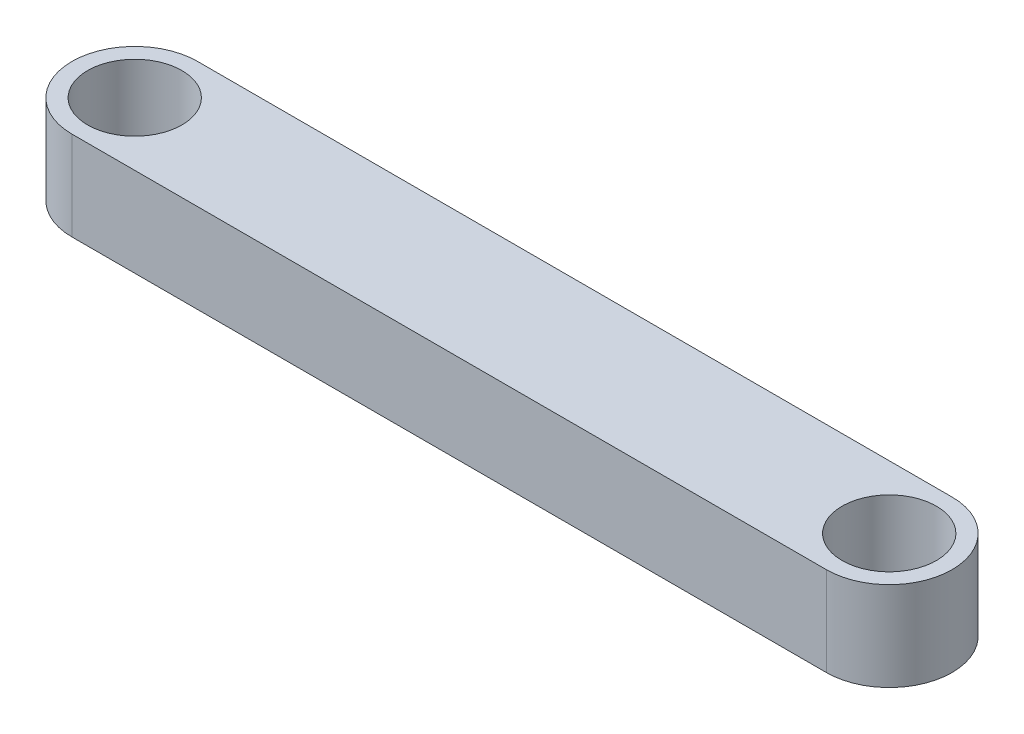
ISO-10303-21;
HEADER;
FILE_DESCRIPTION(('STEP AP214'),'2;1');
FILE_NAME('part.step','',(''),(''),'','','');
FILE_SCHEMA(('AUTOMOTIVE_DESIGN { 1 0 10303 214 1 1 1 1 }'));
ENDSEC;
DATA;
#1=APPLICATION_CONTEXT('core data for automotive mechanical design processes');
#2=APPLICATION_PROTOCOL_DEFINITION('international standard','automotive_design',2000,#1);
#3=PRODUCT_CONTEXT('',#1,'mechanical');
#4=PRODUCT('Part','Part','',(#3));
#5=PRODUCT_RELATED_PRODUCT_CATEGORY('part','',(#4));
#6=PRODUCT_DEFINITION_FORMATION('','',#4);
#7=PRODUCT_DEFINITION_CONTEXT('part definition',#1,'design');
#8=PRODUCT_DEFINITION('design','',#6,#7);
#9=PRODUCT_DEFINITION_SHAPE('','',#8);
#10=(LENGTH_UNIT() NAMED_UNIT(*) SI_UNIT(.MILLI.,.METRE.));
#11=(NAMED_UNIT(*) PLANE_ANGLE_UNIT() SI_UNIT($,.RADIAN.));
#12=(NAMED_UNIT(*) SI_UNIT($,.STERADIAN.) SOLID_ANGLE_UNIT());
#13=UNCERTAINTY_MEASURE_WITH_UNIT(LENGTH_MEASURE(1.E-05),#10,'distance_accuracy_value','');
#14=(GEOMETRIC_REPRESENTATION_CONTEXT(3) GLOBAL_UNCERTAINTY_ASSIGNED_CONTEXT((#13)) GLOBAL_UNIT_ASSIGNED_CONTEXT((#10,
#11,#12)) REPRESENTATION_CONTEXT('',''));
#15=CARTESIAN_POINT('',(0.,0.,0.));
#16=DIRECTION('',(0.,0.,1.));
#17=DIRECTION('',(1.,0.,0.));
#18=AXIS2_PLACEMENT_3D('',#15,#16,#17);
#19=CARTESIAN_POINT('',(158.75,37.5,0.));
#20=DIRECTION('',(0.,-1.,0.));
#21=DIRECTION('',(0.,0.,-1.));
#22=AXIS2_PLACEMENT_3D('',#19,#20,#21);
#23=PLANE('',#22);
#24=CARTESIAN_POINT('',(158.75,37.5,0.));
#25=DIRECTION('',(0.,1.,0.));
#26=DIRECTION('',(0.,0.,-1.));
#27=AXIS2_PLACEMENT_3D('',#24,#25,#26);
#28=CIRCLE('',#27,26.4583333333333);
#29=CARTESIAN_POINT('',(158.75,37.5,26.4583333333333));
#30=VERTEX_POINT('',#29);
#31=CARTESIAN_POINT('',(158.75,37.5,-26.4583333333333));
#32=VERTEX_POINT('',#31);
#33=EDGE_CURVE('E92',#30,#32,#28,.T.);
#34=ORIENTED_EDGE('',*,*,#33,.T.);
#35=DIRECTION('',(-1.,0.,0.));
#36=VECTOR('',#35,1.);
#37=CARTESIAN_POINT('',(-158.75,37.5,-26.4583333333333));
#38=LINE('',#37,#36);
#39=CARTESIAN_POINT('',(-158.75,37.5,-26.4583333333333));
#40=VERTEX_POINT('',#39);
#41=EDGE_CURVE('E87',#32,#40,#38,.T.);
#42=ORIENTED_EDGE('',*,*,#41,.T.);
#43=CARTESIAN_POINT('',(-158.75,37.5,0.));
#44=DIRECTION('',(0.,1.,0.));
#45=DIRECTION('',(0.,0.,1.));
#46=AXIS2_PLACEMENT_3D('',#43,#44,#45);
#47=CIRCLE('',#46,26.4583333333333);
#48=CARTESIAN_POINT('',(-158.75,37.5,26.4583333333333));
#49=VERTEX_POINT('',#48);
#50=EDGE_CURVE('E90',#40,#49,#47,.T.);
#51=ORIENTED_EDGE('',*,*,#50,.T.);
#52=DIRECTION('',(1.,0.,0.));
#53=VECTOR('',#52,1.);
#54=CARTESIAN_POINT('',(-158.75,37.5,26.4583333333333));
#55=LINE('',#54,#53);
#56=EDGE_CURVE('E57',#49,#30,#55,.T.);
#57=ORIENTED_EDGE('',*,*,#56,.T.);
#58=EDGE_LOOP('',(#34,#42,#51,#57));
#59=FACE_BOUND('',#58,.T.);
#60=CARTESIAN_POINT('',(-158.75,37.5,0.));
#61=DIRECTION('',(0.,1.,0.));
#62=DIRECTION('',(0.,0.,1.));
#63=AXIS2_PLACEMENT_3D('',#60,#61,#62);
#64=CIRCLE('',#63,19.84375);
#65=CARTESIAN_POINT('',(-158.75,37.5,19.84375));
#66=VERTEX_POINT('',#65);
#67=EDGE_CURVE('E112',#66,#66,#64,.T.);
#68=ORIENTED_EDGE('',*,*,#67,.F.);
#69=EDGE_LOOP('',(#68));
#70=FACE_BOUND('',#69,.T.);
#71=CARTESIAN_POINT('',(158.75,37.5,0.));
#72=DIRECTION('',(0.,1.,0.));
#73=DIRECTION('',(0.,0.,1.));
#74=AXIS2_PLACEMENT_3D('',#71,#72,#73);
#75=CIRCLE('',#74,19.84375);
#76=CARTESIAN_POINT('',(158.75,37.5,19.84375));
#77=VERTEX_POINT('',#76);
#78=EDGE_CURVE('E134',#77,#77,#75,.T.);
#79=ORIENTED_EDGE('',*,*,#78,.F.);
#80=EDGE_LOOP('',(#79));
#81=FACE_BOUND('',#80,.T.);
#82=ADVANCED_FACE('F39',(#59,#70,#81),#23,.F.);
#83=CARTESIAN_POINT('',(158.75,0.,0.));
#84=DIRECTION('',(0.,-1.,0.));
#85=DIRECTION('',(0.,0.,-1.));
#86=AXIS2_PLACEMENT_3D('',#83,#84,#85);
#87=PLANE('',#86);
#88=CARTESIAN_POINT('',(-158.75,0.,0.));
#89=DIRECTION('',(0.,1.,0.));
#90=DIRECTION('',(0.,0.,1.));
#91=AXIS2_PLACEMENT_3D('',#88,#89,#90);
#92=CIRCLE('',#91,19.84375);
#93=CARTESIAN_POINT('',(-158.75,0.,19.84375));
#94=VERTEX_POINT('',#93);
#95=EDGE_CURVE('E130',#94,#94,#92,.T.);
#96=ORIENTED_EDGE('',*,*,#95,.T.);
#97=EDGE_LOOP('',(#96));
#98=FACE_BOUND('',#97,.T.);
#99=CARTESIAN_POINT('',(158.75,0.,0.));
#100=DIRECTION('',(0.,1.,0.));
#101=DIRECTION('',(0.,0.,-1.));
#102=AXIS2_PLACEMENT_3D('',#99,#100,#101);
#103=CIRCLE('',#102,26.4583333333333);
#104=CARTESIAN_POINT('',(158.75,0.,26.4583333333333));
#105=VERTEX_POINT('',#104);
#106=CARTESIAN_POINT('',(158.75,0.,-26.4583333333333));
#107=VERTEX_POINT('',#106);
#108=EDGE_CURVE('E108',#105,#107,#103,.T.);
#109=ORIENTED_EDGE('',*,*,#108,.F.);
#110=DIRECTION('',(1.,0.,0.));
#111=VECTOR('',#110,1.);
#112=CARTESIAN_POINT('',(-158.75,0.,26.4583333333333));
#113=LINE('',#112,#111);
#114=CARTESIAN_POINT('',(-158.75,0.,26.4583333333333));
#115=VERTEX_POINT('',#114);
#116=EDGE_CURVE('E80',#115,#105,#113,.T.);
#117=ORIENTED_EDGE('',*,*,#116,.F.);
#118=CARTESIAN_POINT('',(-158.75,0.,0.));
#119=DIRECTION('',(0.,1.,0.));
#120=DIRECTION('',(0.,0.,1.));
#121=AXIS2_PLACEMENT_3D('',#118,#119,#120);
#122=CIRCLE('',#121,26.4583333333333);
#123=CARTESIAN_POINT('',(-158.75,0.,-26.4583333333333));
#124=VERTEX_POINT('',#123);
#125=EDGE_CURVE('E74',#124,#115,#122,.T.);
#126=ORIENTED_EDGE('',*,*,#125,.F.);
#127=DIRECTION('',(-1.,0.,0.));
#128=VECTOR('',#127,1.);
#129=CARTESIAN_POINT('',(-158.75,0.,-26.4583333333333));
#130=LINE('',#129,#128);
#131=EDGE_CURVE('E97',#107,#124,#130,.T.);
#132=ORIENTED_EDGE('',*,*,#131,.F.);
#133=EDGE_LOOP('',(#109,#117,#126,#132));
#134=FACE_BOUND('',#133,.T.);
#135=CARTESIAN_POINT('',(158.75,0.,0.));
#136=DIRECTION('',(0.,1.,0.));
#137=DIRECTION('',(0.,0.,1.));
#138=AXIS2_PLACEMENT_3D('',#135,#136,#137);
#139=CIRCLE('',#138,19.84375);
#140=CARTESIAN_POINT('',(158.75,0.,19.84375));
#141=VERTEX_POINT('',#140);
#142=EDGE_CURVE('E138',#141,#141,#139,.T.);
#143=ORIENTED_EDGE('',*,*,#142,.T.);
#144=EDGE_LOOP('',(#143));
#145=FACE_BOUND('',#144,.T.);
#146=ADVANCED_FACE('F125',(#98,#134,#145),#87,.T.);
#147=CARTESIAN_POINT('',(158.75,37.5,0.));
#148=DIRECTION('',(0.,-1.,0.));
#149=DIRECTION('',(0.,0.,-1.));
#150=AXIS2_PLACEMENT_3D('',#147,#148,#149);
#151=CYLINDRICAL_SURFACE('',#150,26.4583333333333);
#152=ORIENTED_EDGE('',*,*,#108,.T.);
#153=DIRECTION('',(0.,-1.,0.));
#154=VECTOR('',#153,1.);
#155=CARTESIAN_POINT('',(158.75,37.5,-26.4583333333333));
#156=LINE('',#155,#154);
#157=EDGE_CURVE('E11',#32,#107,#156,.T.);
#158=ORIENTED_EDGE('',*,*,#157,.F.);
#159=ORIENTED_EDGE('',*,*,#33,.F.);
#160=DIRECTION('',(0.,-1.,0.));
#161=VECTOR('',#160,1.);
#162=CARTESIAN_POINT('',(158.75,37.5,26.4583333333333));
#163=LINE('',#162,#161);
#164=EDGE_CURVE('E104',#30,#105,#163,.T.);
#165=ORIENTED_EDGE('',*,*,#164,.T.);
#166=EDGE_LOOP('',(#152,#158,#159,#165));
#167=FACE_BOUND('',#166,.T.);
#168=ADVANCED_FACE('F41',(#167),#151,.T.);
#169=CARTESIAN_POINT('',(-158.75,37.5,-26.4583333333333));
#170=DIRECTION('',(0.,0.,1.));
#171=DIRECTION('',(1.,0.,0.));
#172=AXIS2_PLACEMENT_3D('',#169,#170,#171);
#173=PLANE('',#172);
#174=ORIENTED_EDGE('',*,*,#131,.T.);
#175=DIRECTION('',(0.,-1.,0.));
#176=VECTOR('',#175,1.);
#177=CARTESIAN_POINT('',(-158.75,37.5,-26.4583333333333));
#178=LINE('',#177,#176);
#179=EDGE_CURVE('E49',#40,#124,#178,.T.);
#180=ORIENTED_EDGE('',*,*,#179,.F.);
#181=ORIENTED_EDGE('',*,*,#41,.F.);
#182=ORIENTED_EDGE('',*,*,#157,.T.);
#183=EDGE_LOOP('',(#174,#180,#181,#182));
#184=FACE_BOUND('',#183,.T.);
#185=ADVANCED_FACE('F96',(#184),#173,.F.);
#186=CARTESIAN_POINT('',(-158.75,37.5,0.));
#187=DIRECTION('',(0.,-1.,0.));
#188=DIRECTION('',(0.,0.,-1.));
#189=AXIS2_PLACEMENT_3D('',#186,#187,#188);
#190=CYLINDRICAL_SURFACE('',#189,26.4583333333333);
#191=ORIENTED_EDGE('',*,*,#125,.T.);
#192=DIRECTION('',(0.,-1.,0.));
#193=VECTOR('',#192,1.);
#194=CARTESIAN_POINT('',(-158.75,37.5,26.4583333333333));
#195=LINE('',#194,#193);
#196=EDGE_CURVE('E99',#49,#115,#195,.T.);
#197=ORIENTED_EDGE('',*,*,#196,.F.);
#198=ORIENTED_EDGE('',*,*,#50,.F.);
#199=ORIENTED_EDGE('',*,*,#179,.T.);
#200=EDGE_LOOP('',(#191,#197,#198,#199));
#201=FACE_BOUND('',#200,.T.);
#202=ADVANCED_FACE('F100',(#201),#190,.T.);
#203=CARTESIAN_POINT('',(-158.75,37.5,26.4583333333333));
#204=DIRECTION('',(0.,0.,-1.));
#205=DIRECTION('',(-1.,0.,0.));
#206=AXIS2_PLACEMENT_3D('',#203,#204,#205);
#207=PLANE('',#206);
#208=ORIENTED_EDGE('',*,*,#116,.T.);
#209=ORIENTED_EDGE('',*,*,#164,.F.);
#210=ORIENTED_EDGE('',*,*,#56,.F.);
#211=ORIENTED_EDGE('',*,*,#196,.T.);
#212=EDGE_LOOP('',(#208,#209,#210,#211));
#213=FACE_BOUND('',#212,.T.);
#214=ADVANCED_FACE('F122',(#213),#207,.F.);
#215=CARTESIAN_POINT('',(-158.75,37.5,0.));
#216=DIRECTION('',(0.,-1.,0.));
#217=DIRECTION('',(0.,0.,-1.));
#218=AXIS2_PLACEMENT_3D('',#215,#216,#217);
#219=CYLINDRICAL_SURFACE('',#218,19.84375);
#220=ORIENTED_EDGE('',*,*,#67,.T.);
#221=EDGE_LOOP('',(#220));
#222=FACE_BOUND('',#221,.T.);
#223=ORIENTED_EDGE('',*,*,#95,.F.);
#224=EDGE_LOOP('',(#223));
#225=FACE_BOUND('',#224,.T.);
#226=ADVANCED_FACE('F157',(#222,#225),#219,.F.);
#227=CARTESIAN_POINT('',(158.75,37.5,0.));
#228=DIRECTION('',(0.,-1.,0.));
#229=DIRECTION('',(0.,0.,-1.));
#230=AXIS2_PLACEMENT_3D('',#227,#228,#229);
#231=CYLINDRICAL_SURFACE('',#230,19.84375);
#232=ORIENTED_EDGE('',*,*,#78,.T.);
#233=EDGE_LOOP('',(#232));
#234=FACE_BOUND('',#233,.T.);
#235=ORIENTED_EDGE('',*,*,#142,.F.);
#236=EDGE_LOOP('',(#235));
#237=FACE_BOUND('',#236,.T.);
#238=ADVANCED_FACE('F146',(#234,#237),#231,.F.);
#239=CLOSED_SHELL('',(#82,#146,#168,#185,#202,#214,#226,#238));
#240=MANIFOLD_SOLID_BREP('B2',#239);
#241=ADVANCED_BREP_SHAPE_REPRESENTATION('',(#18,#240),#14);
#242=SHAPE_DEFINITION_REPRESENTATION(#9,#241);
ENDSEC;
END-ISO-10303-21;
